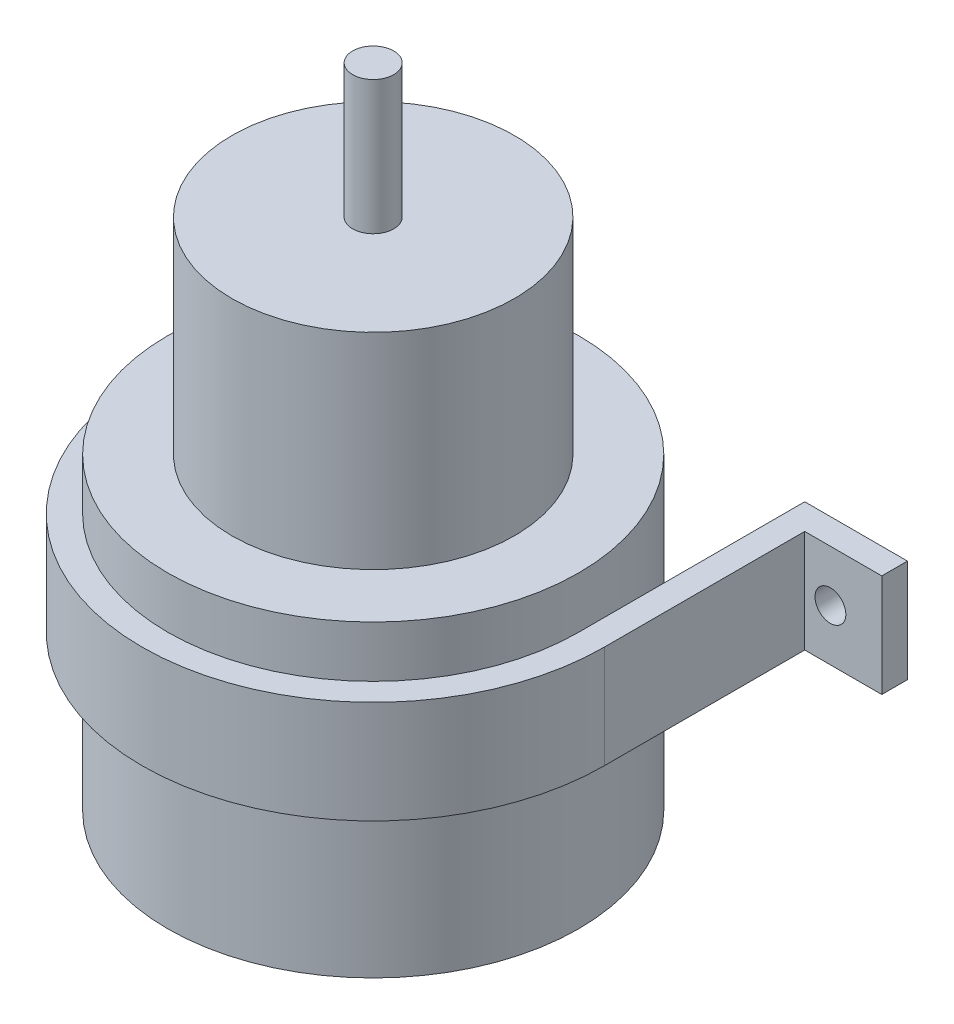
ISO-10303-21;
HEADER;
FILE_DESCRIPTION(('STEP AP214'),'2;1');
FILE_NAME('part.step','',(''),(''),'','','');
FILE_SCHEMA(('AUTOMOTIVE_DESIGN { 1 0 10303 214 1 1 1 1 }'));
ENDSEC;
DATA;
#1=APPLICATION_CONTEXT('core data for automotive mechanical design processes');
#2=APPLICATION_PROTOCOL_DEFINITION('international standard','automotive_design',2000,#1);
#3=PRODUCT_CONTEXT('',#1,'mechanical');
#4=PRODUCT('Part','Part','',(#3));
#5=PRODUCT_RELATED_PRODUCT_CATEGORY('part','',(#4));
#6=PRODUCT_DEFINITION_FORMATION('','',#4);
#7=PRODUCT_DEFINITION_CONTEXT('part definition',#1,'design');
#8=PRODUCT_DEFINITION('design','',#6,#7);
#9=PRODUCT_DEFINITION_SHAPE('','',#8);
#10=(LENGTH_UNIT() NAMED_UNIT(*) SI_UNIT(.MILLI.,.METRE.));
#11=(NAMED_UNIT(*) PLANE_ANGLE_UNIT() SI_UNIT($,.RADIAN.));
#12=(NAMED_UNIT(*) SI_UNIT($,.STERADIAN.) SOLID_ANGLE_UNIT());
#13=UNCERTAINTY_MEASURE_WITH_UNIT(LENGTH_MEASURE(1.E-05),#10,'distance_accuracy_value','');
#14=(GEOMETRIC_REPRESENTATION_CONTEXT(3) GLOBAL_UNCERTAINTY_ASSIGNED_CONTEXT((#13)) GLOBAL_UNIT_ASSIGNED_CONTEXT((#10,
#11,#12)) REPRESENTATION_CONTEXT('',''));
#15=CARTESIAN_POINT('',(0.,0.,0.));
#16=DIRECTION('',(0.,0.,1.));
#17=DIRECTION('',(1.,0.,0.));
#18=AXIS2_PLACEMENT_3D('',#15,#16,#17);
#19=CARTESIAN_POINT('',(0.,30.,0.));
#20=DIRECTION('',(0.,-1.,0.));
#21=DIRECTION('',(0.,0.,-1.));
#22=AXIS2_PLACEMENT_3D('',#19,#20,#21);
#23=CYLINDRICAL_SURFACE('',#22,20.);
#24=CARTESIAN_POINT('',(0.,0.,0.));
#25=DIRECTION('',(0.,1.,0.));
#26=DIRECTION('',(0.,0.,1.));
#27=AXIS2_PLACEMENT_3D('',#24,#25,#26);
#28=CIRCLE('',#27,20.);
#29=CARTESIAN_POINT('',(0.,0.,20.));
#30=VERTEX_POINT('',#29);
#31=EDGE_CURVE('E40',#30,#30,#28,.T.);
#32=ORIENTED_EDGE('',*,*,#31,.T.);
#33=EDGE_LOOP('',(#32));
#34=FACE_BOUND('',#33,.T.);
#35=CARTESIAN_POINT('',(0.,30.,0.));
#36=DIRECTION('',(0.,1.,0.));
#37=DIRECTION('',(0.,0.,1.));
#38=AXIS2_PLACEMENT_3D('',#35,#36,#37);
#39=CIRCLE('',#38,20.);
#40=CARTESIAN_POINT('',(0.,30.,20.));
#41=VERTEX_POINT('',#40);
#42=EDGE_CURVE('E45',#41,#41,#39,.T.);
#43=ORIENTED_EDGE('',*,*,#42,.F.);
#44=EDGE_LOOP('',(#43));
#45=FACE_BOUND('',#44,.T.);
#46=CARTESIAN_POINT('',(0.,15.,0.));
#47=DIRECTION('',(0.,1.,0.));
#48=DIRECTION('',(0.,0.,1.));
#49=AXIS2_PLACEMENT_3D('',#46,#47,#48);
#50=CIRCLE('',#49,20.);
#51=CARTESIAN_POINT('',(-20.,15.,0.));
#52=VERTEX_POINT('',#51);
#53=CARTESIAN_POINT('',(20.,15.,0.));
#54=VERTEX_POINT('',#53);
#55=EDGE_CURVE('E506',#52,#54,#50,.T.);
#56=ORIENTED_EDGE('',*,*,#55,.F.);
#57=DIRECTION('',(0.,1.,0.));
#58=VECTOR('',#57,1.);
#59=CARTESIAN_POINT('',(-20.,15.,0.));
#60=LINE('',#59,#58);
#61=CARTESIAN_POINT('',(-20.,25.,0.));
#62=VERTEX_POINT('',#61);
#63=EDGE_CURVE('E207',#52,#62,#60,.T.);
#64=ORIENTED_EDGE('',*,*,#63,.T.);
#65=CARTESIAN_POINT('',(0.,25.,0.));
#66=DIRECTION('',(0.,1.,0.));
#67=DIRECTION('',(0.,0.,1.));
#68=AXIS2_PLACEMENT_3D('',#65,#66,#67);
#69=CIRCLE('',#68,20.);
#70=CARTESIAN_POINT('',(20.,25.,0.));
#71=VERTEX_POINT('',#70);
#72=EDGE_CURVE('E176',#62,#71,#69,.T.);
#73=ORIENTED_EDGE('',*,*,#72,.T.);
#74=DIRECTION('',(0.,1.,0.));
#75=VECTOR('',#74,1.);
#76=CARTESIAN_POINT('',(20.,15.,0.));
#77=LINE('',#76,#75);
#78=EDGE_CURVE('E210',#54,#71,#77,.T.);
#79=ORIENTED_EDGE('',*,*,#78,.F.);
#80=EDGE_LOOP('',(#56,#64,#73,#79));
#81=FACE_BOUND('',#80,.T.);
#82=ADVANCED_FACE('F37',(#34,#45,#81),#23,.T.);
#83=CARTESIAN_POINT('',(0.,30.,0.));
#84=DIRECTION('',(0.,1.,0.));
#85=DIRECTION('',(0.,0.,1.));
#86=AXIS2_PLACEMENT_3D('',#83,#84,#85);
#87=PLANE('',#86);
#88=CARTESIAN_POINT('',(0.,30.,0.));
#89=DIRECTION('',(0.,1.,0.));
#90=DIRECTION('',(0.,0.,1.));
#91=AXIS2_PLACEMENT_3D('',#88,#89,#90);
#92=CIRCLE('',#91,13.75);
#93=CARTESIAN_POINT('',(0.,30.,13.75));
#94=VERTEX_POINT('',#93);
#95=EDGE_CURVE('E11',#94,#94,#92,.T.);
#96=ORIENTED_EDGE('',*,*,#95,.F.);
#97=EDGE_LOOP('',(#96));
#98=FACE_BOUND('',#97,.T.);
#99=ORIENTED_EDGE('',*,*,#42,.T.);
#100=EDGE_LOOP('',(#99));
#101=FACE_BOUND('',#100,.T.);
#102=ADVANCED_FACE('F237',(#98,#101),#87,.T.);
#103=CARTESIAN_POINT('',(0.,0.,0.));
#104=DIRECTION('',(0.,1.,0.));
#105=DIRECTION('',(0.,0.,1.));
#106=AXIS2_PLACEMENT_3D('',#103,#104,#105);
#107=PLANE('',#106);
#108=ORIENTED_EDGE('',*,*,#31,.F.);
#109=EDGE_LOOP('',(#108));
#110=FACE_BOUND('',#109,.T.);
#111=ADVANCED_FACE('F234',(#110),#107,.F.);
#112=CARTESIAN_POINT('',(0.,50.,0.));
#113=DIRECTION('',(0.,-1.,0.));
#114=DIRECTION('',(0.,0.,-1.));
#115=AXIS2_PLACEMENT_3D('',#112,#113,#114);
#116=CYLINDRICAL_SURFACE('',#115,13.75);
#117=CARTESIAN_POINT('',(0.,50.,0.));
#118=DIRECTION('',(0.,1.,0.));
#119=DIRECTION('',(0.,0.,1.));
#120=AXIS2_PLACEMENT_3D('',#117,#118,#119);
#121=CIRCLE('',#120,13.75);
#122=CARTESIAN_POINT('',(0.,50.,13.75));
#123=VERTEX_POINT('',#122);
#124=EDGE_CURVE('E222',#123,#123,#121,.T.);
#125=ORIENTED_EDGE('',*,*,#124,.F.);
#126=EDGE_LOOP('',(#125));
#127=FACE_BOUND('',#126,.T.);
#128=ORIENTED_EDGE('',*,*,#95,.T.);
#129=EDGE_LOOP('',(#128));
#130=FACE_BOUND('',#129,.T.);
#131=ADVANCED_FACE('F236',(#127,#130),#116,.T.);
#132=CARTESIAN_POINT('',(0.,50.,0.));
#133=DIRECTION('',(0.,1.,0.));
#134=DIRECTION('',(0.,0.,1.));
#135=AXIS2_PLACEMENT_3D('',#132,#133,#134);
#136=PLANE('',#135);
#137=CARTESIAN_POINT('',(0.,50.,0.));
#138=DIRECTION('',(0.,1.,0.));
#139=DIRECTION('',(0.,0.,1.));
#140=AXIS2_PLACEMENT_3D('',#137,#138,#139);
#141=CIRCLE('',#140,2.);
#142=CARTESIAN_POINT('',(0.,50.,2.));
#143=VERTEX_POINT('',#142);
#144=EDGE_CURVE('E196',#143,#143,#141,.T.);
#145=ORIENTED_EDGE('',*,*,#144,.F.);
#146=EDGE_LOOP('',(#145));
#147=FACE_BOUND('',#146,.T.);
#148=ORIENTED_EDGE('',*,*,#124,.T.);
#149=EDGE_LOOP('',(#148));
#150=FACE_BOUND('',#149,.T.);
#151=ADVANCED_FACE('F242',(#147,#150),#136,.T.);
#152=CARTESIAN_POINT('',(0.,63.,0.));
#153=DIRECTION('',(0.,-1.,0.));
#154=DIRECTION('',(0.,0.,-1.));
#155=AXIS2_PLACEMENT_3D('',#152,#153,#154);
#156=CYLINDRICAL_SURFACE('',#155,2.);
#157=CARTESIAN_POINT('',(0.,63.,0.));
#158=DIRECTION('',(0.,1.,0.));
#159=DIRECTION('',(0.,0.,1.));
#160=AXIS2_PLACEMENT_3D('',#157,#158,#159);
#161=CIRCLE('',#160,2.);
#162=CARTESIAN_POINT('',(0.,63.,2.));
#163=VERTEX_POINT('',#162);
#164=EDGE_CURVE('E219',#163,#163,#161,.T.);
#165=ORIENTED_EDGE('',*,*,#164,.F.);
#166=EDGE_LOOP('',(#165));
#167=FACE_BOUND('',#166,.T.);
#168=ORIENTED_EDGE('',*,*,#144,.T.);
#169=EDGE_LOOP('',(#168));
#170=FACE_BOUND('',#169,.T.);
#171=ADVANCED_FACE('F275',(#167,#170),#156,.T.);
#172=CARTESIAN_POINT('',(0.,63.,0.));
#173=DIRECTION('',(0.,1.,0.));
#174=DIRECTION('',(0.,0.,1.));
#175=AXIS2_PLACEMENT_3D('',#172,#173,#174);
#176=PLANE('',#175);
#177=ORIENTED_EDGE('',*,*,#164,.T.);
#178=EDGE_LOOP('',(#177));
#179=FACE_BOUND('',#178,.T.);
#180=ADVANCED_FACE('F285',(#179),#176,.T.);
#181=CARTESIAN_POINT('',(20.,15.,-19.5));
#182=DIRECTION('',(0.,0.,1.));
#183=DIRECTION('',(1.,0.,0.));
#184=AXIS2_PLACEMENT_3D('',#181,#182,#183);
#185=PLANE('',#184);
#186=CARTESIAN_POINT('',(25.,20.,-19.5));
#187=DIRECTION('',(0.,0.,1.));
#188=DIRECTION('',(1.,0.,0.));
#189=AXIS2_PLACEMENT_3D('',#186,#187,#188);
#190=CIRCLE('',#189,1.5);
#191=CARTESIAN_POINT('',(26.5,20.,-19.5));
#192=VERTEX_POINT('',#191);
#193=EDGE_CURVE('E494',#192,#192,#190,.T.);
#194=ORIENTED_EDGE('',*,*,#193,.F.);
#195=EDGE_LOOP('',(#194));
#196=FACE_BOUND('',#195,.T.);
#197=DIRECTION('',(1.,0.,0.));
#198=VECTOR('',#197,1.);
#199=CARTESIAN_POINT('',(20.,25.,-19.5));
#200=LINE('',#199,#198);
#201=CARTESIAN_POINT('',(22.5,25.,-19.5));
#202=VERTEX_POINT('',#201);
#203=CARTESIAN_POINT('',(30.,25.,-19.5));
#204=VERTEX_POINT('',#203);
#205=EDGE_CURVE('E166',#202,#204,#200,.T.);
#206=ORIENTED_EDGE('',*,*,#205,.F.);
#207=DIRECTION('',(0.,1.,0.));
#208=VECTOR('',#207,1.);
#209=CARTESIAN_POINT('',(22.5,15.,-19.5));
#210=LINE('',#209,#208);
#211=CARTESIAN_POINT('',(22.5,15.,-19.5));
#212=VERTEX_POINT('',#211);
#213=EDGE_CURVE('E62',#212,#202,#210,.T.);
#214=ORIENTED_EDGE('',*,*,#213,.F.);
#215=DIRECTION('',(1.,0.,0.));
#216=VECTOR('',#215,1.);
#217=CARTESIAN_POINT('',(20.,15.,-19.5));
#218=LINE('',#217,#216);
#219=CARTESIAN_POINT('',(30.,15.,-19.5));
#220=VERTEX_POINT('',#219);
#221=EDGE_CURVE('E194',#212,#220,#218,.T.);
#222=ORIENTED_EDGE('',*,*,#221,.T.);
#223=DIRECTION('',(0.,1.,0.));
#224=VECTOR('',#223,1.);
#225=CARTESIAN_POINT('',(30.,15.,-19.5));
#226=LINE('',#225,#224);
#227=EDGE_CURVE('E165',#220,#204,#226,.T.);
#228=ORIENTED_EDGE('',*,*,#227,.T.);
#229=EDGE_LOOP('',(#206,#214,#222,#228));
#230=FACE_BOUND('',#229,.T.);
#231=ADVANCED_FACE('F295',(#196,#230),#185,.T.);
#232=CARTESIAN_POINT('',(22.5,15.,0.));
#233=DIRECTION('',(1.,0.,0.));
#234=DIRECTION('',(0.,0.,-1.));
#235=AXIS2_PLACEMENT_3D('',#232,#233,#234);
#236=PLANE('',#235);
#237=DIRECTION('',(0.,0.,-1.));
#238=VECTOR('',#237,1.);
#239=CARTESIAN_POINT('',(22.5,25.,0.));
#240=LINE('',#239,#238);
#241=CARTESIAN_POINT('',(22.5,25.,0.));
#242=VERTEX_POINT('',#241);
#243=EDGE_CURVE('E191',#242,#202,#240,.T.);
#244=ORIENTED_EDGE('',*,*,#243,.F.);
#245=DIRECTION('',(0.,1.,0.));
#246=VECTOR('',#245,1.);
#247=CARTESIAN_POINT('',(22.5,15.,0.));
#248=LINE('',#247,#246);
#249=CARTESIAN_POINT('',(22.5,15.,0.));
#250=VERTEX_POINT('',#249);
#251=EDGE_CURVE('E147',#250,#242,#248,.T.);
#252=ORIENTED_EDGE('',*,*,#251,.F.);
#253=DIRECTION('',(0.,0.,-1.));
#254=VECTOR('',#253,1.);
#255=CARTESIAN_POINT('',(22.5,15.,0.));
#256=LINE('',#255,#254);
#257=EDGE_CURVE('E155',#250,#212,#256,.T.);
#258=ORIENTED_EDGE('',*,*,#257,.T.);
#259=ORIENTED_EDGE('',*,*,#213,.T.);
#260=EDGE_LOOP('',(#244,#252,#258,#259));
#261=FACE_BOUND('',#260,.T.);
#262=ADVANCED_FACE('F307',(#261),#236,.T.);
#263=CARTESIAN_POINT('',(0.,15.,0.));
#264=DIRECTION('',(0.,1.,0.));
#265=DIRECTION('',(0.,0.,1.));
#266=AXIS2_PLACEMENT_3D('',#263,#264,#265);
#267=CYLINDRICAL_SURFACE('',#266,22.5);
#268=CARTESIAN_POINT('',(0.,25.,0.));
#269=DIRECTION('',(0.,1.,0.));
#270=DIRECTION('',(1.,0.,0.));
#271=AXIS2_PLACEMENT_3D('',#268,#269,#270);
#272=CIRCLE('',#271,22.5);
#273=CARTESIAN_POINT('',(-22.5,25.,0.));
#274=VERTEX_POINT('',#273);
#275=EDGE_CURVE('E142',#274,#242,#272,.T.);
#276=ORIENTED_EDGE('',*,*,#275,.F.);
#277=DIRECTION('',(0.,1.,0.));
#278=VECTOR('',#277,1.);
#279=CARTESIAN_POINT('',(-22.5,15.,0.));
#280=LINE('',#279,#278);
#281=CARTESIAN_POINT('',(-22.5,15.,0.));
#282=VERTEX_POINT('',#281);
#283=EDGE_CURVE('E136',#282,#274,#280,.T.);
#284=ORIENTED_EDGE('',*,*,#283,.F.);
#285=CARTESIAN_POINT('',(0.,15.,0.));
#286=DIRECTION('',(0.,1.,0.));
#287=DIRECTION('',(1.,0.,0.));
#288=AXIS2_PLACEMENT_3D('',#285,#286,#287);
#289=CIRCLE('',#288,22.5);
#290=EDGE_CURVE('E139',#282,#250,#289,.T.);
#291=ORIENTED_EDGE('',*,*,#290,.T.);
#292=ORIENTED_EDGE('',*,*,#251,.T.);
#293=EDGE_LOOP('',(#276,#284,#291,#292));
#294=FACE_BOUND('',#293,.T.);
#295=ADVANCED_FACE('F138',(#294),#267,.T.);
#296=CARTESIAN_POINT('',(-22.5,15.,0.));
#297=DIRECTION('',(-1.,0.,0.));
#298=DIRECTION('',(0.,0.,1.));
#299=AXIS2_PLACEMENT_3D('',#296,#297,#298);
#300=PLANE('',#299);
#301=DIRECTION('',(0.,0.,-1.));
#302=VECTOR('',#301,1.);
#303=CARTESIAN_POINT('',(-22.5,25.,0.));
#304=LINE('',#303,#302);
#305=CARTESIAN_POINT('',(-22.5,25.,-19.5));
#306=VERTEX_POINT('',#305);
#307=EDGE_CURVE('E188',#306,#274,#304,.F.);
#308=ORIENTED_EDGE('',*,*,#307,.F.);
#309=DIRECTION('',(0.,1.,0.));
#310=VECTOR('',#309,1.);
#311=CARTESIAN_POINT('',(-22.5,15.,-19.5));
#312=LINE('',#311,#310);
#313=CARTESIAN_POINT('',(-22.5,15.,-19.5));
#314=VERTEX_POINT('',#313);
#315=EDGE_CURVE('E148',#314,#306,#312,.T.);
#316=ORIENTED_EDGE('',*,*,#315,.F.);
#317=DIRECTION('',(0.,0.,-1.));
#318=VECTOR('',#317,1.);
#319=CARTESIAN_POINT('',(-22.5,15.,0.));
#320=LINE('',#319,#318);
#321=EDGE_CURVE('E153',#314,#282,#320,.F.);
#322=ORIENTED_EDGE('',*,*,#321,.T.);
#323=ORIENTED_EDGE('',*,*,#283,.T.);
#324=EDGE_LOOP('',(#308,#316,#322,#323));
#325=FACE_BOUND('',#324,.T.);
#326=ADVANCED_FACE('F157',(#325),#300,.T.);
#327=CARTESIAN_POINT('',(-20.,15.,-19.5));
#328=DIRECTION('',(0.,0.,1.));
#329=DIRECTION('',(1.,0.,0.));
#330=AXIS2_PLACEMENT_3D('',#327,#328,#329);
#331=PLANE('',#330);
#332=CARTESIAN_POINT('',(-25.,20.,-19.5));
#333=DIRECTION('',(0.,0.,1.));
#334=DIRECTION('',(1.,0.,0.));
#335=AXIS2_PLACEMENT_3D('',#332,#333,#334);
#336=CIRCLE('',#335,1.5);
#337=CARTESIAN_POINT('',(-23.5,20.,-19.5));
#338=VERTEX_POINT('',#337);
#339=EDGE_CURVE('E170',#338,#338,#336,.T.);
#340=ORIENTED_EDGE('',*,*,#339,.F.);
#341=EDGE_LOOP('',(#340));
#342=FACE_BOUND('',#341,.T.);
#343=DIRECTION('',(1.,0.,0.));
#344=VECTOR('',#343,1.);
#345=CARTESIAN_POINT('',(-20.,25.,-19.5));
#346=LINE('',#345,#344);
#347=CARTESIAN_POINT('',(-30.,25.,-19.5));
#348=VERTEX_POINT('',#347);
#349=EDGE_CURVE('E185',#348,#306,#346,.T.);
#350=ORIENTED_EDGE('',*,*,#349,.F.);
#351=DIRECTION('',(0.,1.,0.));
#352=VECTOR('',#351,1.);
#353=CARTESIAN_POINT('',(-30.,15.,-19.5));
#354=LINE('',#353,#352);
#355=CARTESIAN_POINT('',(-30.,15.,-19.5));
#356=VERTEX_POINT('',#355);
#357=EDGE_CURVE('E199',#356,#348,#354,.T.);
#358=ORIENTED_EDGE('',*,*,#357,.F.);
#359=DIRECTION('',(1.,0.,0.));
#360=VECTOR('',#359,1.);
#361=CARTESIAN_POINT('',(-20.,15.,-19.5));
#362=LINE('',#361,#360);
#363=EDGE_CURVE('E158',#356,#314,#362,.T.);
#364=ORIENTED_EDGE('',*,*,#363,.T.);
#365=ORIENTED_EDGE('',*,*,#315,.T.);
#366=EDGE_LOOP('',(#350,#358,#364,#365));
#367=FACE_BOUND('',#366,.T.);
#368=ADVANCED_FACE('F328',(#342,#367),#331,.T.);
#369=CARTESIAN_POINT('',(-30.,15.,-19.5));
#370=DIRECTION('',(1.,0.,0.));
#371=DIRECTION('',(0.,0.,-1.));
#372=AXIS2_PLACEMENT_3D('',#369,#370,#371);
#373=PLANE('',#372);
#374=DIRECTION('',(0.,0.,-1.));
#375=VECTOR('',#374,1.);
#376=CARTESIAN_POINT('',(-30.,25.,-19.5));
#377=LINE('',#376,#375);
#378=CARTESIAN_POINT('',(-30.,25.,-22.));
#379=VERTEX_POINT('',#378);
#380=EDGE_CURVE('E183',#348,#379,#377,.T.);
#381=ORIENTED_EDGE('',*,*,#380,.T.);
#382=DIRECTION('',(0.,1.,0.));
#383=VECTOR('',#382,1.);
#384=CARTESIAN_POINT('',(-30.,15.,-22.));
#385=LINE('',#384,#383);
#386=CARTESIAN_POINT('',(-30.,15.,-22.));
#387=VERTEX_POINT('',#386);
#388=EDGE_CURVE('E201',#387,#379,#385,.T.);
#389=ORIENTED_EDGE('',*,*,#388,.F.);
#390=DIRECTION('',(0.,0.,-1.));
#391=VECTOR('',#390,1.);
#392=CARTESIAN_POINT('',(-30.,15.,-19.5));
#393=LINE('',#392,#391);
#394=EDGE_CURVE('E160',#356,#387,#393,.T.);
#395=ORIENTED_EDGE('',*,*,#394,.F.);
#396=ORIENTED_EDGE('',*,*,#357,.T.);
#397=EDGE_LOOP('',(#381,#389,#395,#396));
#398=FACE_BOUND('',#397,.T.);
#399=ADVANCED_FACE('F335',(#398),#373,.F.);
#400=CARTESIAN_POINT('',(-20.,15.,-22.));
#401=DIRECTION('',(0.,0.,1.));
#402=DIRECTION('',(1.,0.,0.));
#403=AXIS2_PLACEMENT_3D('',#400,#401,#402);
#404=PLANE('',#403);
#405=CARTESIAN_POINT('',(-25.,20.,-22.));
#406=DIRECTION('',(0.,0.,-1.));
#407=DIRECTION('',(1.,0.,0.));
#408=AXIS2_PLACEMENT_3D('',#405,#406,#407);
#409=CIRCLE('',#408,1.5);
#410=CARTESIAN_POINT('',(-23.5,20.,-22.));
#411=VERTEX_POINT('',#410);
#412=EDGE_CURVE('E490',#411,#411,#409,.T.);
#413=ORIENTED_EDGE('',*,*,#412,.F.);
#414=EDGE_LOOP('',(#413));
#415=FACE_BOUND('',#414,.T.);
#416=DIRECTION('',(1.,0.,0.));
#417=VECTOR('',#416,1.);
#418=CARTESIAN_POINT('',(-20.,25.,-22.));
#419=LINE('',#418,#417);
#420=CARTESIAN_POINT('',(-20.,25.,-22.));
#421=VERTEX_POINT('',#420);
#422=EDGE_CURVE('E181',#379,#421,#419,.T.);
#423=ORIENTED_EDGE('',*,*,#422,.T.);
#424=DIRECTION('',(0.,1.,0.));
#425=VECTOR('',#424,1.);
#426=CARTESIAN_POINT('',(-20.,15.,-22.));
#427=LINE('',#426,#425);
#428=CARTESIAN_POINT('',(-20.,15.,-22.));
#429=VERTEX_POINT('',#428);
#430=EDGE_CURVE('E204',#429,#421,#427,.T.);
#431=ORIENTED_EDGE('',*,*,#430,.F.);
#432=DIRECTION('',(1.,0.,0.));
#433=VECTOR('',#432,1.);
#434=CARTESIAN_POINT('',(-20.,15.,-22.));
#435=LINE('',#434,#433);
#436=EDGE_CURVE('E510',#387,#429,#435,.T.);
#437=ORIENTED_EDGE('',*,*,#436,.F.);
#438=ORIENTED_EDGE('',*,*,#388,.T.);
#439=EDGE_LOOP('',(#423,#431,#437,#438));
#440=FACE_BOUND('',#439,.T.);
#441=ADVANCED_FACE('F343',(#415,#440),#404,.F.);
#442=CARTESIAN_POINT('',(-20.,15.,0.));
#443=DIRECTION('',(-1.,0.,0.));
#444=DIRECTION('',(0.,0.,1.));
#445=AXIS2_PLACEMENT_3D('',#442,#443,#444);
#446=PLANE('',#445);
#447=DIRECTION('',(0.,0.,1.));
#448=VECTOR('',#447,1.);
#449=CARTESIAN_POINT('',(-20.,25.,0.));
#450=LINE('',#449,#448);
#451=EDGE_CURVE('E179',#421,#62,#450,.T.);
#452=ORIENTED_EDGE('',*,*,#451,.T.);
#453=ORIENTED_EDGE('',*,*,#63,.F.);
#454=DIRECTION('',(0.,0.,1.));
#455=VECTOR('',#454,1.);
#456=CARTESIAN_POINT('',(-20.,15.,0.));
#457=LINE('',#456,#455);
#458=EDGE_CURVE('E508',#429,#52,#457,.T.);
#459=ORIENTED_EDGE('',*,*,#458,.F.);
#460=ORIENTED_EDGE('',*,*,#430,.T.);
#461=EDGE_LOOP('',(#452,#453,#459,#460));
#462=FACE_BOUND('',#461,.T.);
#463=ADVANCED_FACE('F351',(#462),#446,.F.);
#464=CARTESIAN_POINT('',(20.,15.,0.));
#465=DIRECTION('',(1.,0.,0.));
#466=DIRECTION('',(0.,0.,-1.));
#467=AXIS2_PLACEMENT_3D('',#464,#465,#466);
#468=PLANE('',#467);
#469=DIRECTION('',(0.,0.,-1.));
#470=VECTOR('',#469,1.);
#471=CARTESIAN_POINT('',(20.,25.,0.));
#472=LINE('',#471,#470);
#473=CARTESIAN_POINT('',(20.,25.,-22.));
#474=VERTEX_POINT('',#473);
#475=EDGE_CURVE('E53',#71,#474,#472,.T.);
#476=ORIENTED_EDGE('',*,*,#475,.T.);
#477=DIRECTION('',(0.,1.,0.));
#478=VECTOR('',#477,1.);
#479=CARTESIAN_POINT('',(20.,15.,-22.));
#480=LINE('',#479,#478);
#481=CARTESIAN_POINT('',(20.,15.,-22.));
#482=VERTEX_POINT('',#481);
#483=EDGE_CURVE('E212',#482,#474,#480,.T.);
#484=ORIENTED_EDGE('',*,*,#483,.F.);
#485=DIRECTION('',(0.,0.,-1.));
#486=VECTOR('',#485,1.);
#487=CARTESIAN_POINT('',(20.,15.,0.));
#488=LINE('',#487,#486);
#489=EDGE_CURVE('E504',#54,#482,#488,.T.);
#490=ORIENTED_EDGE('',*,*,#489,.F.);
#491=ORIENTED_EDGE('',*,*,#78,.T.);
#492=EDGE_LOOP('',(#476,#484,#490,#491));
#493=FACE_BOUND('',#492,.T.);
#494=ADVANCED_FACE('F359',(#493),#468,.F.);
#495=CARTESIAN_POINT('',(20.,15.,-22.));
#496=DIRECTION('',(0.,0.,1.));
#497=DIRECTION('',(1.,0.,0.));
#498=AXIS2_PLACEMENT_3D('',#495,#496,#497);
#499=PLANE('',#498);
#500=CARTESIAN_POINT('',(25.,20.,-22.));
#501=DIRECTION('',(0.,0.,-1.));
#502=DIRECTION('',(-1.,0.,0.));
#503=AXIS2_PLACEMENT_3D('',#500,#501,#502);
#504=CIRCLE('',#503,1.5);
#505=CARTESIAN_POINT('',(23.5,20.,-22.));
#506=VERTEX_POINT('',#505);
#507=EDGE_CURVE('E491',#506,#506,#504,.T.);
#508=ORIENTED_EDGE('',*,*,#507,.F.);
#509=EDGE_LOOP('',(#508));
#510=FACE_BOUND('',#509,.T.);
#511=DIRECTION('',(1.,0.,0.));
#512=VECTOR('',#511,1.);
#513=CARTESIAN_POINT('',(20.,25.,-22.));
#514=LINE('',#513,#512);
#515=CARTESIAN_POINT('',(30.,25.,-22.));
#516=VERTEX_POINT('',#515);
#517=EDGE_CURVE('E173',#474,#516,#514,.T.);
#518=ORIENTED_EDGE('',*,*,#517,.T.);
#519=DIRECTION('',(0.,1.,0.));
#520=VECTOR('',#519,1.);
#521=CARTESIAN_POINT('',(30.,15.,-22.));
#522=LINE('',#521,#520);
#523=CARTESIAN_POINT('',(30.,15.,-22.));
#524=VERTEX_POINT('',#523);
#525=EDGE_CURVE('E215',#524,#516,#522,.T.);
#526=ORIENTED_EDGE('',*,*,#525,.F.);
#527=DIRECTION('',(1.,0.,0.));
#528=VECTOR('',#527,1.);
#529=CARTESIAN_POINT('',(20.,15.,-22.));
#530=LINE('',#529,#528);
#531=EDGE_CURVE('E502',#482,#524,#530,.T.);
#532=ORIENTED_EDGE('',*,*,#531,.F.);
#533=ORIENTED_EDGE('',*,*,#483,.T.);
#534=EDGE_LOOP('',(#518,#526,#532,#533));
#535=FACE_BOUND('',#534,.T.);
#536=ADVANCED_FACE('F367',(#510,#535),#499,.F.);
#537=CARTESIAN_POINT('',(30.,15.,-22.));
#538=DIRECTION('',(-1.,0.,0.));
#539=DIRECTION('',(0.,0.,1.));
#540=AXIS2_PLACEMENT_3D('',#537,#538,#539);
#541=PLANE('',#540);
#542=DIRECTION('',(0.,0.,1.));
#543=VECTOR('',#542,1.);
#544=CARTESIAN_POINT('',(30.,25.,-22.));
#545=LINE('',#544,#543);
#546=EDGE_CURVE('E169',#516,#204,#545,.T.);
#547=ORIENTED_EDGE('',*,*,#546,.T.);
#548=ORIENTED_EDGE('',*,*,#227,.F.);
#549=DIRECTION('',(0.,0.,1.));
#550=VECTOR('',#549,1.);
#551=CARTESIAN_POINT('',(30.,15.,-22.));
#552=LINE('',#551,#550);
#553=EDGE_CURVE('E108',#524,#220,#552,.T.);
#554=ORIENTED_EDGE('',*,*,#553,.F.);
#555=ORIENTED_EDGE('',*,*,#525,.T.);
#556=EDGE_LOOP('',(#547,#548,#554,#555));
#557=FACE_BOUND('',#556,.T.);
#558=ADVANCED_FACE('F375',(#557),#541,.F.);
#559=CARTESIAN_POINT('',(0.,15.,0.));
#560=DIRECTION('',(0.,1.,0.));
#561=DIRECTION('',(1.,0.,0.));
#562=AXIS2_PLACEMENT_3D('',#559,#560,#561);
#563=PLANE('',#562);
#564=ORIENTED_EDGE('',*,*,#221,.F.);
#565=ORIENTED_EDGE('',*,*,#257,.F.);
#566=ORIENTED_EDGE('',*,*,#290,.F.);
#567=ORIENTED_EDGE('',*,*,#321,.F.);
#568=ORIENTED_EDGE('',*,*,#363,.F.);
#569=ORIENTED_EDGE('',*,*,#394,.T.);
#570=ORIENTED_EDGE('',*,*,#436,.T.);
#571=ORIENTED_EDGE('',*,*,#458,.T.);
#572=ORIENTED_EDGE('',*,*,#55,.T.);
#573=ORIENTED_EDGE('',*,*,#489,.T.);
#574=ORIENTED_EDGE('',*,*,#531,.T.);
#575=ORIENTED_EDGE('',*,*,#553,.T.);
#576=EDGE_LOOP('',(#564,#565,#566,#567,#568,#569,#570,#571,#572,#573,#574,#575));
#577=FACE_BOUND('',#576,.T.);
#578=ADVANCED_FACE('F151',(#577),#563,.F.);
#579=CARTESIAN_POINT('',(0.,25.,0.));
#580=DIRECTION('',(0.,1.,0.));
#581=DIRECTION('',(1.,0.,0.));
#582=AXIS2_PLACEMENT_3D('',#579,#580,#581);
#583=PLANE('',#582);
#584=ORIENTED_EDGE('',*,*,#205,.T.);
#585=ORIENTED_EDGE('',*,*,#546,.F.);
#586=ORIENTED_EDGE('',*,*,#517,.F.);
#587=ORIENTED_EDGE('',*,*,#475,.F.);
#588=ORIENTED_EDGE('',*,*,#72,.F.);
#589=ORIENTED_EDGE('',*,*,#451,.F.);
#590=ORIENTED_EDGE('',*,*,#422,.F.);
#591=ORIENTED_EDGE('',*,*,#380,.F.);
#592=ORIENTED_EDGE('',*,*,#349,.T.);
#593=ORIENTED_EDGE('',*,*,#307,.T.);
#594=ORIENTED_EDGE('',*,*,#275,.T.);
#595=ORIENTED_EDGE('',*,*,#243,.T.);
#596=EDGE_LOOP('',(#584,#585,#586,#587,#588,#589,#590,#591,#592,#593,#594,#595));
#597=FACE_BOUND('',#596,.T.);
#598=ADVANCED_FACE('F390',(#597),#583,.T.);
#599=CARTESIAN_POINT('',(25.,20.,-12.));
#600=DIRECTION('',(0.,0.,-1.));
#601=DIRECTION('',(-1.,0.,0.));
#602=AXIS2_PLACEMENT_3D('',#599,#600,#601);
#603=CYLINDRICAL_SURFACE('',#602,1.5);
#604=ORIENTED_EDGE('',*,*,#193,.T.);
#605=EDGE_LOOP('',(#604));
#606=FACE_BOUND('',#605,.T.);
#607=ORIENTED_EDGE('',*,*,#507,.T.);
#608=EDGE_LOOP('',(#607));
#609=FACE_BOUND('',#608,.T.);
#610=ADVANCED_FACE('F396',(#606,#609),#603,.F.);
#611=CARTESIAN_POINT('',(-25.,20.,-12.));
#612=DIRECTION('',(0.,0.,-1.));
#613=DIRECTION('',(-1.,0.,0.));
#614=AXIS2_PLACEMENT_3D('',#611,#612,#613);
#615=CYLINDRICAL_SURFACE('',#614,1.5);
#616=ORIENTED_EDGE('',*,*,#339,.T.);
#617=EDGE_LOOP('',(#616));
#618=FACE_BOUND('',#617,.T.);
#619=ORIENTED_EDGE('',*,*,#412,.T.);
#620=EDGE_LOOP('',(#619));
#621=FACE_BOUND('',#620,.T.);
#622=ADVANCED_FACE('F402',(#618,#621),#615,.F.);
#623=CLOSED_SHELL('',(#82,#102,#111,#131,#151,#171,#180,#231,#262,#295,#326,#368,#399,#441,#463,
#494,#536,#558,#578,#598,#610,#622));
#624=MANIFOLD_SOLID_BREP('B2',#623);
#625=ADVANCED_BREP_SHAPE_REPRESENTATION('',(#18,#624),#14);
#626=SHAPE_DEFINITION_REPRESENTATION(#9,#625);
ENDSEC;
END-ISO-10303-21;
